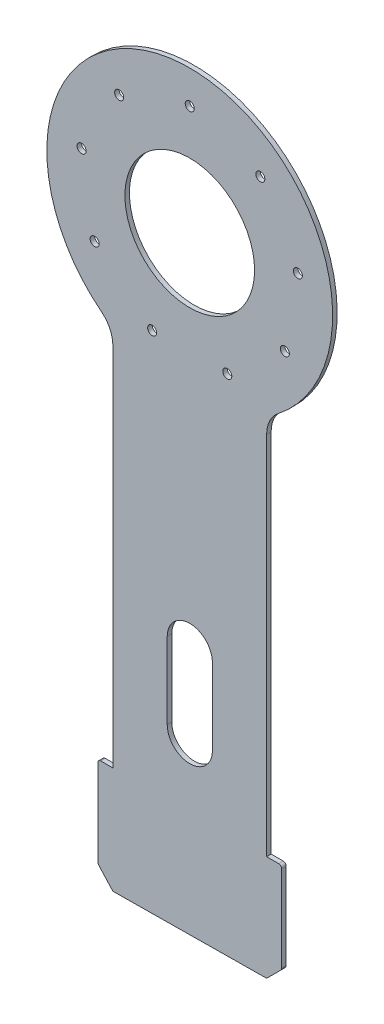
ISO-10303-21;
HEADER;
FILE_DESCRIPTION(('STEP AP214'),'2;1');
FILE_NAME('part.step','',(''),(''),'','','');
FILE_SCHEMA(('AUTOMOTIVE_DESIGN { 1 0 10303 214 1 1 1 1 }'));
ENDSEC;
DATA;
#1=APPLICATION_CONTEXT('core data for automotive mechanical design processes');
#2=APPLICATION_PROTOCOL_DEFINITION('international standard','automotive_design',2000,#1);
#3=PRODUCT_CONTEXT('',#1,'mechanical');
#4=PRODUCT('Part','Part','',(#3));
#5=PRODUCT_RELATED_PRODUCT_CATEGORY('part','',(#4));
#6=PRODUCT_DEFINITION_FORMATION('','',#4);
#7=PRODUCT_DEFINITION_CONTEXT('part definition',#1,'design');
#8=PRODUCT_DEFINITION('design','',#6,#7);
#9=PRODUCT_DEFINITION_SHAPE('','',#8);
#10=(LENGTH_UNIT() NAMED_UNIT(*) SI_UNIT(.MILLI.,.METRE.));
#11=(NAMED_UNIT(*) PLANE_ANGLE_UNIT() SI_UNIT($,.RADIAN.));
#12=(NAMED_UNIT(*) SI_UNIT($,.STERADIAN.) SOLID_ANGLE_UNIT());
#13=UNCERTAINTY_MEASURE_WITH_UNIT(LENGTH_MEASURE(1.E-05),#10,'distance_accuracy_value','');
#14=(GEOMETRIC_REPRESENTATION_CONTEXT(3) GLOBAL_UNCERTAINTY_ASSIGNED_CONTEXT((#13)) GLOBAL_UNIT_ASSIGNED_CONTEXT((#10,
#11,#12)) REPRESENTATION_CONTEXT('',''));
#15=CARTESIAN_POINT('',(0.,0.,0.));
#16=DIRECTION('',(0.,0.,1.));
#17=DIRECTION('',(1.,0.,0.));
#18=AXIS2_PLACEMENT_3D('',#15,#16,#17);
#19=CARTESIAN_POINT('',(0.,0.,1.5));
#20=DIRECTION('',(0.,0.,1.));
#21=DIRECTION('',(1.,0.,0.));
#22=AXIS2_PLACEMENT_3D('',#19,#20,#21);
#23=PLANE('',#22);
#24=CARTESIAN_POINT('',(0.0199531847322761,-145.2854308119,1.5));
#25=DIRECTION('',(0.,0.,-1.));
#26=DIRECTION('',(-1.,0.,0.));
#27=AXIS2_PLACEMENT_3D('',#24,#25,#26);
#28=CIRCLE('',#27,7.5);
#29=CARTESIAN_POINT('',(7.51995318473228,-145.2854308119,1.5));
#30=VERTEX_POINT('',#29);
#31=CARTESIAN_POINT('',(-7.48004681526772,-145.2854308119,1.5));
#32=VERTEX_POINT('',#31);
#33=EDGE_CURVE('E196',#30,#32,#28,.T.);
#34=ORIENTED_EDGE('',*,*,#33,.T.);
#35=DIRECTION('',(0.,1.,0.));
#36=VECTOR('',#35,1.);
#37=CARTESIAN_POINT('',(-7.48004681526772,-145.2854308119,1.5));
#38=LINE('',#37,#36);
#39=CARTESIAN_POINT('',(-7.48004681526772,-119.8854308119,1.5));
#40=VERTEX_POINT('',#39);
#41=EDGE_CURVE('E206',#32,#40,#38,.T.);
#42=ORIENTED_EDGE('',*,*,#41,.T.);
#43=CARTESIAN_POINT('',(0.0199531847322759,-119.8854308119,1.5));
#44=DIRECTION('',(0.,0.,-1.));
#45=DIRECTION('',(-1.,0.,0.));
#46=AXIS2_PLACEMENT_3D('',#43,#44,#45);
#47=CIRCLE('',#46,7.5);
#48=CARTESIAN_POINT('',(7.51995318473228,-119.8854308119,1.5));
#49=VERTEX_POINT('',#48);
#50=EDGE_CURVE('E61',#40,#49,#47,.T.);
#51=ORIENTED_EDGE('',*,*,#50,.T.);
#52=DIRECTION('',(0.,-1.,0.));
#53=VECTOR('',#52,1.);
#54=CARTESIAN_POINT('',(7.51995318473228,-145.2854308119,1.5));
#55=LINE('',#54,#53);
#56=EDGE_CURVE('E203',#49,#30,#55,.T.);
#57=ORIENTED_EDGE('',*,*,#56,.T.);
#58=EDGE_LOOP('',(#34,#42,#51,#57));
#59=FACE_BOUND('',#58,.T.);
#60=DIRECTION('',(0.,-1.,0.));
#61=VECTOR('',#60,1.);
#62=CARTESIAN_POINT('',(-30.5634382136855,-166.784492961634,1.5));
#63=LINE('',#62,#61);
#64=CARTESIAN_POINT('',(-30.5634382136855,-167.784492961634,1.5));
#65=VERTEX_POINT('',#64);
#66=CARTESIAN_POINT('',(-30.5634382136855,-196.39800400519,1.5));
#67=VERTEX_POINT('',#66);
#68=EDGE_CURVE('E283',#65,#67,#63,.T.);
#69=ORIENTED_EDGE('',*,*,#68,.T.);
#70=CARTESIAN_POINT('',(-29.5634382136855,-196.39800400519,1.5));
#71=DIRECTION('',(0.,0.,1.));
#72=DIRECTION('',(1.,0.,0.));
#73=AXIS2_PLACEMENT_3D('',#70,#71,#72);
#74=CIRCLE('',#73,1.);
#75=CARTESIAN_POINT('',(-30.3035162897634,-197.070524964944,1.5));
#76=VERTEX_POINT('',#75);
#77=EDGE_CURVE('E468',#67,#76,#74,.T.);
#78=ORIENTED_EDGE('',*,*,#77,.T.);
#79=DIRECTION('',(0.672520959754308,-0.740078076077885,0.));
#80=VECTOR('',#79,1.);
#81=CARTESIAN_POINT('',(-30.5634382136855,-196.784492961634,1.5));
#82=LINE('',#81,#80);
#83=CARTESIAN_POINT('',(-25.864982452456,-201.954925272885,1.5));
#84=VERTEX_POINT('',#83);
#85=EDGE_CURVE('E287',#76,#84,#82,.T.);
#86=ORIENTED_EDGE('',*,*,#85,.T.);
#87=CARTESIAN_POINT('',(-25.1249043763781,-201.282404313131,1.5));
#88=DIRECTION('',(0.,0.,1.));
#89=DIRECTION('',(1.,0.,0.));
#90=AXIS2_PLACEMENT_3D('',#87,#88,#89);
#91=CIRCLE('',#90,1.);
#92=CARTESIAN_POINT('',(-25.1150809031183,-202.282356061653,1.5));
#93=VERTEX_POINT('',#92);
#94=EDGE_CURVE('E465',#84,#93,#91,.T.);
#95=ORIENTED_EDGE('',*,*,#94,.T.);
#96=DIRECTION('',(0.999951748522454,0.00982347325978616,0.));
#97=VECTOR('',#96,1.);
#98=CARTESIAN_POINT('',(25.5634382136855,-201.784492961634,1.5));
#99=LINE('',#98,#97);
#100=CARTESIAN_POINT('',(25.1549872725829,-201.788505562146,1.5));
#101=VERTEX_POINT('',#100);
#102=EDGE_CURVE('E291',#93,#101,#99,.T.);
#103=ORIENTED_EDGE('',*,*,#102,.T.);
#104=CARTESIAN_POINT('',(25.1451637993231,-200.788553813623,1.5));
#105=DIRECTION('',(0.,0.,1.));
#106=DIRECTION('',(1.,0.,0.));
#107=AXIS2_PLACEMENT_3D('',#104,#105,#106);
#108=CIRCLE('',#107,1.);
#109=CARTESIAN_POINT('',(25.8522705805096,-201.49566059481,1.5));
#110=VERTEX_POINT('',#109);
#111=EDGE_CURVE('E462',#101,#110,#108,.T.);
#112=ORIENTED_EDGE('',*,*,#111,.T.);
#113=DIRECTION('',(0.707106781186548,0.707106781186547,0.));
#114=VECTOR('',#113,1.);
#115=CARTESIAN_POINT('',(30.5634382136856,-196.784492961634,1.5));
#116=LINE('',#115,#114);
#117=CARTESIAN_POINT('',(30.2705449948722,-197.077386180447,1.5));
#118=VERTEX_POINT('',#117);
#119=EDGE_CURVE('E295',#110,#118,#116,.T.);
#120=ORIENTED_EDGE('',*,*,#119,.T.);
#121=CARTESIAN_POINT('',(29.5634382136856,-196.370279399261,1.5));
#122=DIRECTION('',(0.,0.,1.));
#123=DIRECTION('',(1.,0.,0.));
#124=AXIS2_PLACEMENT_3D('',#121,#122,#123);
#125=CIRCLE('',#124,1.);
#126=CARTESIAN_POINT('',(30.5634382136856,-196.370279399261,1.5));
#127=VERTEX_POINT('',#126);
#128=EDGE_CURVE('E459',#118,#127,#125,.T.);
#129=ORIENTED_EDGE('',*,*,#128,.T.);
#130=DIRECTION('',(0.,1.,0.));
#131=VECTOR('',#130,1.);
#132=CARTESIAN_POINT('',(30.5634382136856,-166.774492961634,1.5));
#133=LINE('',#132,#131);
#134=CARTESIAN_POINT('',(30.5634382136856,-167.774492961634,1.5));
#135=VERTEX_POINT('',#134);
#136=EDGE_CURVE('E299',#127,#135,#133,.T.);
#137=ORIENTED_EDGE('',*,*,#136,.T.);
#138=CARTESIAN_POINT('',(29.5634382136856,-167.774492961634,1.5));
#139=DIRECTION('',(0.,0.,1.));
#140=DIRECTION('',(1.,0.,0.));
#141=AXIS2_PLACEMENT_3D('',#138,#139,#140);
#142=CIRCLE('',#141,1.);
#143=CARTESIAN_POINT('',(29.5634382136856,-166.774492961634,1.5));
#144=VERTEX_POINT('',#143);
#145=EDGE_CURVE('E435',#135,#144,#142,.T.);
#146=ORIENTED_EDGE('',*,*,#145,.T.);
#147=DIRECTION('',(-1.,0.,0.));
#148=VECTOR('',#147,1.);
#149=CARTESIAN_POINT('',(25.5634382136855,-166.774492961634,1.5));
#150=LINE('',#149,#148);
#151=CARTESIAN_POINT('',(25.5634382136855,-166.774492961634,1.5));
#152=VERTEX_POINT('',#151);
#153=EDGE_CURVE('E302',#144,#152,#150,.T.);
#154=ORIENTED_EDGE('',*,*,#153,.T.);
#155=DIRECTION('',(0.,1.,0.));
#156=VECTOR('',#155,1.);
#157=CARTESIAN_POINT('',(25.5634382136855,-40.0344929616335,1.5));
#158=LINE('',#157,#156);
#159=CARTESIAN_POINT('',(25.5634382136855,-45.1828713388312,1.5));
#160=VERTEX_POINT('',#159);
#161=EDGE_CURVE('E246',#152,#160,#158,.T.);
#162=ORIENTED_EDGE('',*,*,#161,.T.);
#163=CARTESIAN_POINT('',(35.5634382136855,-45.1828713388312,1.5));
#164=DIRECTION('',(0.,0.,1.));
#165=DIRECTION('',(1.,0.,0.));
#166=AXIS2_PLACEMENT_3D('',#163,#164,#165);
#167=CIRCLE('',#166,10.);
#168=CARTESIAN_POINT('',(29.3784924373924,-37.3249806712084,1.5));
#169=VERTEX_POINT('',#168);
#170=EDGE_CURVE('E422',#160,#169,#167,.F.);
#171=ORIENTED_EDGE('',*,*,#170,.T.);
#172=CARTESIAN_POINT('',(0.,0.,1.5));
#173=DIRECTION('',(0.,0.,1.));
#174=DIRECTION('',(1.,0.,0.));
#175=AXIS2_PLACEMENT_3D('',#172,#173,#174);
#176=CIRCLE('',#175,47.5);
#177=CARTESIAN_POINT('',(-29.3784924373924,-37.3249806712084,1.5));
#178=VERTEX_POINT('',#177);
#179=EDGE_CURVE('E396',#169,#178,#176,.T.);
#180=ORIENTED_EDGE('',*,*,#179,.T.);
#181=CARTESIAN_POINT('',(-35.5634382136855,-45.1828713388312,1.5));
#182=DIRECTION('',(0.,0.,1.));
#183=DIRECTION('',(1.,0.,0.));
#184=AXIS2_PLACEMENT_3D('',#181,#182,#183);
#185=CIRCLE('',#184,10.);
#186=CARTESIAN_POINT('',(-25.5634382136855,-45.1828713388312,1.5));
#187=VERTEX_POINT('',#186);
#188=EDGE_CURVE('E408',#178,#187,#185,.F.);
#189=ORIENTED_EDGE('',*,*,#188,.T.);
#190=DIRECTION('',(0.,-1.,0.));
#191=VECTOR('',#190,1.);
#192=CARTESIAN_POINT('',(-25.5634382136855,-40.0344929616335,1.5));
#193=LINE('',#192,#191);
#194=CARTESIAN_POINT('',(-25.5634382136855,-166.784492961634,1.5));
#195=VERTEX_POINT('',#194);
#196=EDGE_CURVE('E236',#187,#195,#193,.T.);
#197=ORIENTED_EDGE('',*,*,#196,.T.);
#198=DIRECTION('',(-1.,0.,0.));
#199=VECTOR('',#198,1.);
#200=CARTESIAN_POINT('',(-25.5634382136855,-166.784492961634,1.5));
#201=LINE('',#200,#199);
#202=CARTESIAN_POINT('',(-29.5634382136855,-166.784492961634,1.5));
#203=VERTEX_POINT('',#202);
#204=EDGE_CURVE('E279',#195,#203,#201,.T.);
#205=ORIENTED_EDGE('',*,*,#204,.T.);
#206=CARTESIAN_POINT('',(-29.5634382136855,-167.784492961634,1.5));
#207=DIRECTION('',(0.,0.,1.));
#208=DIRECTION('',(1.,0.,0.));
#209=AXIS2_PLACEMENT_3D('',#206,#207,#208);
#210=CIRCLE('',#209,1.);
#211=EDGE_CURVE('E432',#203,#65,#210,.T.);
#212=ORIENTED_EDGE('',*,*,#211,.T.);
#213=EDGE_LOOP('',(#69,#78,#86,#95,#103,#112,#120,#129,#137,#146,#154,#162,#171,#180,#189,#197,
#205,#212));
#214=FACE_BOUND('',#213,.T.);
#215=CARTESIAN_POINT('',(23.4617477535583,27.960622173843,1.5));
#216=DIRECTION('',(0.,0.,1.));
#217=DIRECTION('',(1.,0.,0.));
#218=AXIS2_PLACEMENT_3D('',#215,#216,#217);
#219=CIRCLE('',#218,1.49999999999999);
#220=CARTESIAN_POINT('',(24.9617477535583,27.960622173843,1.5));
#221=VERTEX_POINT('',#220);
#222=EDGE_CURVE('E312',#221,#221,#219,.T.);
#223=ORIENTED_EDGE('',*,*,#222,.F.);
#224=EDGE_LOOP('',(#223));
#225=FACE_BOUND('',#224,.T.);
#226=CARTESIAN_POINT('',(35.9454829849455,6.33815848484333,1.5));
#227=DIRECTION('',(0.,0.,1.));
#228=DIRECTION('',(1.,0.,0.));
#229=AXIS2_PLACEMENT_3D('',#226,#227,#228);
#230=CIRCLE('',#229,1.49999999999999);
#231=CARTESIAN_POINT('',(37.4454829849455,6.33815848484333,1.5));
#232=VERTEX_POINT('',#231);
#233=EDGE_CURVE('E323',#232,#232,#230,.T.);
#234=ORIENTED_EDGE('',*,*,#233,.F.);
#235=EDGE_LOOP('',(#234));
#236=FACE_BOUND('',#235,.T.);
#237=CARTESIAN_POINT('',(31.6099272381322,-18.2499999999997,1.5));
#238=DIRECTION('',(0.,0.,1.));
#239=DIRECTION('',(1.,0.,0.));
#240=AXIS2_PLACEMENT_3D('',#237,#238,#239);
#241=CIRCLE('',#240,1.49999999999999);
#242=CARTESIAN_POINT('',(33.1099272381322,-18.2499999999997,1.5));
#243=VERTEX_POINT('',#242);
#244=EDGE_CURVE('E331',#243,#243,#241,.T.);
#245=ORIENTED_EDGE('',*,*,#244,.F.);
#246=EDGE_LOOP('',(#245));
#247=FACE_BOUND('',#246,.T.);
#248=CARTESIAN_POINT('',(12.4837352313872,-34.2987806586856,1.5));
#249=DIRECTION('',(0.,0.,1.));
#250=DIRECTION('',(1.,0.,0.));
#251=AXIS2_PLACEMENT_3D('',#248,#249,#250);
#252=CIRCLE('',#251,1.49999999999999);
#253=CARTESIAN_POINT('',(13.9837352313872,-34.2987806586856,1.5));
#254=VERTEX_POINT('',#253);
#255=EDGE_CURVE('E339',#254,#254,#252,.T.);
#256=ORIENTED_EDGE('',*,*,#255,.F.);
#257=EDGE_LOOP('',(#256));
#258=FACE_BOUND('',#257,.T.);
#259=CARTESIAN_POINT('',(-12.4837352313867,-34.2987806586857,1.5));
#260=DIRECTION('',(0.,0.,1.));
#261=DIRECTION('',(1.,0.,0.));
#262=AXIS2_PLACEMENT_3D('',#259,#260,#261);
#263=CIRCLE('',#262,1.49999999999999);
#264=CARTESIAN_POINT('',(-10.9837352313867,-34.2987806586857,1.5));
#265=VERTEX_POINT('',#264);
#266=EDGE_CURVE('E347',#265,#265,#263,.T.);
#267=ORIENTED_EDGE('',*,*,#266,.F.);
#268=EDGE_LOOP('',(#267));
#269=FACE_BOUND('',#268,.T.);
#270=CARTESIAN_POINT('',(-31.6099272381319,-18.2500000000001,1.5));
#271=DIRECTION('',(0.,0.,1.));
#272=DIRECTION('',(1.,0.,0.));
#273=AXIS2_PLACEMENT_3D('',#270,#271,#272);
#274=CIRCLE('',#273,1.49999999999999);
#275=CARTESIAN_POINT('',(-30.1099272381319,-18.2500000000001,1.5));
#276=VERTEX_POINT('',#275);
#277=EDGE_CURVE('E355',#276,#276,#274,.T.);
#278=ORIENTED_EDGE('',*,*,#277,.F.);
#279=EDGE_LOOP('',(#278));
#280=FACE_BOUND('',#279,.T.);
#281=CARTESIAN_POINT('',(-35.9454829849456,6.33815848484285,1.5));
#282=DIRECTION('',(0.,0.,1.));
#283=DIRECTION('',(1.,0.,0.));
#284=AXIS2_PLACEMENT_3D('',#281,#282,#283);
#285=CIRCLE('',#284,1.49999999999999);
#286=CARTESIAN_POINT('',(-34.4454829849456,6.33815848484285,1.5));
#287=VERTEX_POINT('',#286);
#288=EDGE_CURVE('E363',#287,#287,#285,.T.);
#289=ORIENTED_EDGE('',*,*,#288,.F.);
#290=EDGE_LOOP('',(#289));
#291=FACE_BOUND('',#290,.T.);
#292=CARTESIAN_POINT('',(-23.4617477535587,27.9606221738427,1.5));
#293=DIRECTION('',(0.,0.,1.));
#294=DIRECTION('',(1.,0.,0.));
#295=AXIS2_PLACEMENT_3D('',#292,#293,#294);
#296=CIRCLE('',#295,1.49999999999999);
#297=CARTESIAN_POINT('',(-21.9617477535587,27.9606221738427,1.5));
#298=VERTEX_POINT('',#297);
#299=EDGE_CURVE('E371',#298,#298,#296,.T.);
#300=ORIENTED_EDGE('',*,*,#299,.F.);
#301=EDGE_LOOP('',(#300));
#302=FACE_BOUND('',#301,.T.);
#303=CARTESIAN_POINT('',(0.,36.5,1.5));
#304=DIRECTION('',(0.,0.,1.));
#305=DIRECTION('',(1.,0.,0.));
#306=AXIS2_PLACEMENT_3D('',#303,#304,#305);
#307=CIRCLE('',#306,1.49999999999999);
#308=CARTESIAN_POINT('',(1.49999999999999,36.5,1.5));
#309=VERTEX_POINT('',#308);
#310=EDGE_CURVE('E379',#309,#309,#307,.T.);
#311=ORIENTED_EDGE('',*,*,#310,.F.);
#312=EDGE_LOOP('',(#311));
#313=FACE_BOUND('',#312,.T.);
#314=CARTESIAN_POINT('',(0.,0.,1.5));
#315=DIRECTION('',(0.,0.,1.));
#316=DIRECTION('',(1.,0.,0.));
#317=AXIS2_PLACEMENT_3D('',#314,#315,#316);
#318=CIRCLE('',#317,21.55);
#319=CARTESIAN_POINT('',(21.55,0.,1.5));
#320=VERTEX_POINT('',#319);
#321=EDGE_CURVE('E388',#320,#320,#318,.T.);
#322=ORIENTED_EDGE('',*,*,#321,.F.);
#323=EDGE_LOOP('',(#322));
#324=FACE_BOUND('',#323,.T.);
#325=ADVANCED_FACE('F45',(#59,#214,#225,#236,#247,#258,#269,#280,#291,#302,#313,#324),#23,.T.);
#326=CARTESIAN_POINT('',(0.,0.,0.));
#327=DIRECTION('',(0.,0.,1.));
#328=DIRECTION('',(1.,0.,0.));
#329=AXIS2_PLACEMENT_3D('',#326,#327,#328);
#330=PLANE('',#329);
#331=DIRECTION('',(0.,1.,0.));
#332=VECTOR('',#331,1.);
#333=CARTESIAN_POINT('',(-7.48004681526772,-145.2854308119,0.));
#334=LINE('',#333,#332);
#335=CARTESIAN_POINT('',(-7.48004681526772,-145.2854308119,0.));
#336=VERTEX_POINT('',#335);
#337=CARTESIAN_POINT('',(-7.48004681526772,-119.8854308119,0.));
#338=VERTEX_POINT('',#337);
#339=EDGE_CURVE('E227',#336,#338,#334,.T.);
#340=ORIENTED_EDGE('',*,*,#339,.F.);
#341=CARTESIAN_POINT('',(0.0199531847322761,-145.2854308119,0.));
#342=DIRECTION('',(0.,0.,-1.));
#343=DIRECTION('',(-1.,0.,0.));
#344=AXIS2_PLACEMENT_3D('',#341,#342,#343);
#345=CIRCLE('',#344,7.5);
#346=CARTESIAN_POINT('',(7.51995318473228,-145.2854308119,0.));
#347=VERTEX_POINT('',#346);
#348=EDGE_CURVE('E69',#347,#336,#345,.T.);
#349=ORIENTED_EDGE('',*,*,#348,.F.);
#350=DIRECTION('',(0.,-1.,0.));
#351=VECTOR('',#350,1.);
#352=CARTESIAN_POINT('',(7.51995318473228,-145.2854308119,0.));
#353=LINE('',#352,#351);
#354=CARTESIAN_POINT('',(7.51995318473228,-119.8854308119,0.));
#355=VERTEX_POINT('',#354);
#356=EDGE_CURVE('E214',#355,#347,#353,.T.);
#357=ORIENTED_EDGE('',*,*,#356,.F.);
#358=CARTESIAN_POINT('',(0.0199531847322759,-119.8854308119,0.));
#359=DIRECTION('',(0.,0.,-1.));
#360=DIRECTION('',(-1.,0.,0.));
#361=AXIS2_PLACEMENT_3D('',#358,#359,#360);
#362=CIRCLE('',#361,7.5);
#363=EDGE_CURVE('E218',#338,#355,#362,.T.);
#364=ORIENTED_EDGE('',*,*,#363,.F.);
#365=EDGE_LOOP('',(#340,#349,#357,#364));
#366=FACE_BOUND('',#365,.T.);
#367=CARTESIAN_POINT('',(23.4617477535583,27.960622173843,0.));
#368=DIRECTION('',(0.,0.,1.));
#369=DIRECTION('',(1.,0.,0.));
#370=AXIS2_PLACEMENT_3D('',#367,#368,#369);
#371=CIRCLE('',#370,1.49999999999999);
#372=CARTESIAN_POINT('',(24.9617477535583,27.960622173843,0.));
#373=VERTEX_POINT('',#372);
#374=EDGE_CURVE('E319',#373,#373,#371,.T.);
#375=ORIENTED_EDGE('',*,*,#374,.T.);
#376=EDGE_LOOP('',(#375));
#377=FACE_BOUND('',#376,.T.);
#378=CARTESIAN_POINT('',(35.9454829849455,6.33815848484333,0.));
#379=DIRECTION('',(0.,0.,1.));
#380=DIRECTION('',(1.,0.,0.));
#381=AXIS2_PLACEMENT_3D('',#378,#379,#380);
#382=CIRCLE('',#381,1.49999999999999);
#383=CARTESIAN_POINT('',(37.4454829849455,6.33815848484333,0.));
#384=VERTEX_POINT('',#383);
#385=EDGE_CURVE('E327',#384,#384,#382,.T.);
#386=ORIENTED_EDGE('',*,*,#385,.T.);
#387=EDGE_LOOP('',(#386));
#388=FACE_BOUND('',#387,.T.);
#389=CARTESIAN_POINT('',(31.6099272381322,-18.2499999999997,0.));
#390=DIRECTION('',(0.,0.,1.));
#391=DIRECTION('',(1.,0.,0.));
#392=AXIS2_PLACEMENT_3D('',#389,#390,#391);
#393=CIRCLE('',#392,1.49999999999999);
#394=CARTESIAN_POINT('',(33.1099272381322,-18.2499999999997,0.));
#395=VERTEX_POINT('',#394);
#396=EDGE_CURVE('E335',#395,#395,#393,.T.);
#397=ORIENTED_EDGE('',*,*,#396,.T.);
#398=EDGE_LOOP('',(#397));
#399=FACE_BOUND('',#398,.T.);
#400=CARTESIAN_POINT('',(12.4837352313872,-34.2987806586856,0.));
#401=DIRECTION('',(0.,0.,1.));
#402=DIRECTION('',(1.,0.,0.));
#403=AXIS2_PLACEMENT_3D('',#400,#401,#402);
#404=CIRCLE('',#403,1.49999999999999);
#405=CARTESIAN_POINT('',(13.9837352313872,-34.2987806586856,0.));
#406=VERTEX_POINT('',#405);
#407=EDGE_CURVE('E343',#406,#406,#404,.T.);
#408=ORIENTED_EDGE('',*,*,#407,.T.);
#409=EDGE_LOOP('',(#408));
#410=FACE_BOUND('',#409,.T.);
#411=CARTESIAN_POINT('',(-12.4837352313867,-34.2987806586857,0.));
#412=DIRECTION('',(0.,0.,1.));
#413=DIRECTION('',(1.,0.,0.));
#414=AXIS2_PLACEMENT_3D('',#411,#412,#413);
#415=CIRCLE('',#414,1.49999999999999);
#416=CARTESIAN_POINT('',(-10.9837352313867,-34.2987806586857,0.));
#417=VERTEX_POINT('',#416);
#418=EDGE_CURVE('E351',#417,#417,#415,.T.);
#419=ORIENTED_EDGE('',*,*,#418,.T.);
#420=EDGE_LOOP('',(#419));
#421=FACE_BOUND('',#420,.T.);
#422=CARTESIAN_POINT('',(-31.6099272381319,-18.2500000000001,0.));
#423=DIRECTION('',(0.,0.,1.));
#424=DIRECTION('',(1.,0.,0.));
#425=AXIS2_PLACEMENT_3D('',#422,#423,#424);
#426=CIRCLE('',#425,1.49999999999999);
#427=CARTESIAN_POINT('',(-30.1099272381319,-18.2500000000001,0.));
#428=VERTEX_POINT('',#427);
#429=EDGE_CURVE('E359',#428,#428,#426,.T.);
#430=ORIENTED_EDGE('',*,*,#429,.T.);
#431=EDGE_LOOP('',(#430));
#432=FACE_BOUND('',#431,.T.);
#433=CARTESIAN_POINT('',(-35.9454829849456,6.33815848484285,0.));
#434=DIRECTION('',(0.,0.,1.));
#435=DIRECTION('',(1.,0.,0.));
#436=AXIS2_PLACEMENT_3D('',#433,#434,#435);
#437=CIRCLE('',#436,1.49999999999999);
#438=CARTESIAN_POINT('',(-34.4454829849456,6.33815848484285,0.));
#439=VERTEX_POINT('',#438);
#440=EDGE_CURVE('E367',#439,#439,#437,.T.);
#441=ORIENTED_EDGE('',*,*,#440,.T.);
#442=EDGE_LOOP('',(#441));
#443=FACE_BOUND('',#442,.T.);
#444=CARTESIAN_POINT('',(-23.4617477535587,27.9606221738427,0.));
#445=DIRECTION('',(0.,0.,1.));
#446=DIRECTION('',(1.,0.,0.));
#447=AXIS2_PLACEMENT_3D('',#444,#445,#446);
#448=CIRCLE('',#447,1.49999999999999);
#449=CARTESIAN_POINT('',(-21.9617477535587,27.9606221738427,0.));
#450=VERTEX_POINT('',#449);
#451=EDGE_CURVE('E375',#450,#450,#448,.T.);
#452=ORIENTED_EDGE('',*,*,#451,.T.);
#453=EDGE_LOOP('',(#452));
#454=FACE_BOUND('',#453,.T.);
#455=CARTESIAN_POINT('',(0.,36.5,0.));
#456=DIRECTION('',(0.,0.,1.));
#457=DIRECTION('',(1.,0.,0.));
#458=AXIS2_PLACEMENT_3D('',#455,#456,#457);
#459=CIRCLE('',#458,1.49999999999999);
#460=CARTESIAN_POINT('',(1.49999999999999,36.5,0.));
#461=VERTEX_POINT('',#460);
#462=EDGE_CURVE('E383',#461,#461,#459,.T.);
#463=ORIENTED_EDGE('',*,*,#462,.T.);
#464=EDGE_LOOP('',(#463));
#465=FACE_BOUND('',#464,.T.);
#466=DIRECTION('',(0.672520959754308,-0.740078076077885,0.));
#467=VECTOR('',#466,1.);
#468=CARTESIAN_POINT('',(-30.5634382136855,-196.784492961634,0.));
#469=LINE('',#468,#467);
#470=CARTESIAN_POINT('',(-30.3035162897634,-197.070524964944,0.));
#471=VERTEX_POINT('',#470);
#472=CARTESIAN_POINT('',(-25.864982452456,-201.954925272885,0.));
#473=VERTEX_POINT('',#472);
#474=EDGE_CURVE('E254',#471,#473,#469,.T.);
#475=ORIENTED_EDGE('',*,*,#474,.F.);
#476=CARTESIAN_POINT('',(-29.5634382136855,-196.39800400519,0.));
#477=DIRECTION('',(0.,0.,1.));
#478=DIRECTION('',(1.,0.,0.));
#479=AXIS2_PLACEMENT_3D('',#476,#477,#478);
#480=CIRCLE('',#479,1.);
#481=CARTESIAN_POINT('',(-30.5634382136855,-196.39800400519,0.));
#482=VERTEX_POINT('',#481);
#483=EDGE_CURVE('E487',#471,#482,#480,.F.);
#484=ORIENTED_EDGE('',*,*,#483,.T.);
#485=DIRECTION('',(0.,-1.,0.));
#486=VECTOR('',#485,1.);
#487=CARTESIAN_POINT('',(-30.5634382136855,-166.784492961634,0.));
#488=LINE('',#487,#486);
#489=CARTESIAN_POINT('',(-30.5634382136855,-167.784492961634,0.));
#490=VERTEX_POINT('',#489);
#491=EDGE_CURVE('E250',#490,#482,#488,.T.);
#492=ORIENTED_EDGE('',*,*,#491,.F.);
#493=CARTESIAN_POINT('',(-29.5634382136855,-167.784492961634,0.));
#494=DIRECTION('',(0.,0.,1.));
#495=DIRECTION('',(1.,0.,0.));
#496=AXIS2_PLACEMENT_3D('',#493,#494,#495);
#497=CIRCLE('',#496,1.);
#498=CARTESIAN_POINT('',(-29.5634382136855,-166.784492961634,0.));
#499=VERTEX_POINT('',#498);
#500=EDGE_CURVE('E441',#490,#499,#497,.F.);
#501=ORIENTED_EDGE('',*,*,#500,.T.);
#502=DIRECTION('',(-1.,0.,0.));
#503=VECTOR('',#502,1.);
#504=CARTESIAN_POINT('',(-25.5634382136855,-166.784492961634,0.));
#505=LINE('',#504,#503);
#506=CARTESIAN_POINT('',(-25.5634382136855,-166.784492961634,0.));
#507=VERTEX_POINT('',#506);
#508=EDGE_CURVE('E245',#507,#499,#505,.T.);
#509=ORIENTED_EDGE('',*,*,#508,.F.);
#510=DIRECTION('',(0.,-1.,0.));
#511=VECTOR('',#510,1.);
#512=CARTESIAN_POINT('',(-25.5634382136855,-40.0344929616335,0.));
#513=LINE('',#512,#511);
#514=CARTESIAN_POINT('',(-25.5634382136855,-45.1828713388312,0.));
#515=VERTEX_POINT('',#514);
#516=EDGE_CURVE('E242',#515,#507,#513,.T.);
#517=ORIENTED_EDGE('',*,*,#516,.F.);
#518=CARTESIAN_POINT('',(-35.5634382136855,-45.1828713388312,0.));
#519=DIRECTION('',(0.,0.,1.));
#520=DIRECTION('',(1.,0.,0.));
#521=AXIS2_PLACEMENT_3D('',#518,#519,#520);
#522=CIRCLE('',#521,10.);
#523=CARTESIAN_POINT('',(-29.3784924373924,-37.3249806712084,0.));
#524=VERTEX_POINT('',#523);
#525=EDGE_CURVE('E411',#515,#524,#522,.T.);
#526=ORIENTED_EDGE('',*,*,#525,.T.);
#527=CARTESIAN_POINT('',(0.,0.,0.));
#528=DIRECTION('',(0.,0.,1.));
#529=DIRECTION('',(1.,0.,0.));
#530=AXIS2_PLACEMENT_3D('',#527,#528,#529);
#531=CIRCLE('',#530,47.5);
#532=CARTESIAN_POINT('',(29.3784924373924,-37.3249806712084,0.));
#533=VERTEX_POINT('',#532);
#534=EDGE_CURVE('E392',#533,#524,#531,.T.);
#535=ORIENTED_EDGE('',*,*,#534,.F.);
#536=CARTESIAN_POINT('',(35.5634382136855,-45.1828713388312,0.));
#537=DIRECTION('',(0.,0.,1.));
#538=DIRECTION('',(1.,0.,0.));
#539=AXIS2_PLACEMENT_3D('',#536,#537,#538);
#540=CIRCLE('',#539,10.);
#541=CARTESIAN_POINT('',(25.5634382136855,-45.1828713388312,0.));
#542=VERTEX_POINT('',#541);
#543=EDGE_CURVE('E425',#533,#542,#540,.T.);
#544=ORIENTED_EDGE('',*,*,#543,.T.);
#545=DIRECTION('',(0.,1.,0.));
#546=VECTOR('',#545,1.);
#547=CARTESIAN_POINT('',(25.5634382136855,-40.0344929616335,0.));
#548=LINE('',#547,#546);
#549=CARTESIAN_POINT('',(25.5634382136855,-166.774492961634,0.));
#550=VERTEX_POINT('',#549);
#551=EDGE_CURVE('E272',#550,#542,#548,.T.);
#552=ORIENTED_EDGE('',*,*,#551,.F.);
#553=DIRECTION('',(-1.,0.,0.));
#554=VECTOR('',#553,1.);
#555=CARTESIAN_POINT('',(25.5634382136855,-166.774492961634,0.));
#556=LINE('',#555,#554);
#557=CARTESIAN_POINT('',(29.5634382136856,-166.774492961634,0.));
#558=VERTEX_POINT('',#557);
#559=EDGE_CURVE('E269',#558,#550,#556,.T.);
#560=ORIENTED_EDGE('',*,*,#559,.F.);
#561=CARTESIAN_POINT('',(29.5634382136856,-167.774492961634,0.));
#562=DIRECTION('',(0.,0.,1.));
#563=DIRECTION('',(1.,0.,0.));
#564=AXIS2_PLACEMENT_3D('',#561,#562,#563);
#565=CIRCLE('',#564,1.);
#566=CARTESIAN_POINT('',(30.5634382136856,-167.774492961634,0.));
#567=VERTEX_POINT('',#566);
#568=EDGE_CURVE('E444',#558,#567,#565,.F.);
#569=ORIENTED_EDGE('',*,*,#568,.T.);
#570=DIRECTION('',(0.,1.,0.));
#571=VECTOR('',#570,1.);
#572=CARTESIAN_POINT('',(30.5634382136856,-166.774492961634,0.));
#573=LINE('',#572,#571);
#574=CARTESIAN_POINT('',(30.5634382136856,-196.370279399261,0.));
#575=VERTEX_POINT('',#574);
#576=EDGE_CURVE('E266',#575,#567,#573,.T.);
#577=ORIENTED_EDGE('',*,*,#576,.F.);
#578=CARTESIAN_POINT('',(29.5634382136856,-196.370279399261,0.));
#579=DIRECTION('',(0.,0.,1.));
#580=DIRECTION('',(1.,0.,0.));
#581=AXIS2_PLACEMENT_3D('',#578,#579,#580);
#582=CIRCLE('',#581,1.);
#583=CARTESIAN_POINT('',(30.2705449948722,-197.077386180447,0.));
#584=VERTEX_POINT('',#583);
#585=EDGE_CURVE('E478',#575,#584,#582,.F.);
#586=ORIENTED_EDGE('',*,*,#585,.T.);
#587=DIRECTION('',(0.707106781186548,0.707106781186547,0.));
#588=VECTOR('',#587,1.);
#589=CARTESIAN_POINT('',(30.5634382136856,-196.784492961634,0.));
#590=LINE('',#589,#588);
#591=CARTESIAN_POINT('',(25.8522705805096,-201.49566059481,0.));
#592=VERTEX_POINT('',#591);
#593=EDGE_CURVE('E262',#592,#584,#590,.T.);
#594=ORIENTED_EDGE('',*,*,#593,.F.);
#595=CARTESIAN_POINT('',(25.1451637993231,-200.788553813623,0.));
#596=DIRECTION('',(0.,0.,1.));
#597=DIRECTION('',(1.,0.,0.));
#598=AXIS2_PLACEMENT_3D('',#595,#596,#597);
#599=CIRCLE('',#598,1.);
#600=CARTESIAN_POINT('',(25.1549872725829,-201.788505562146,0.));
#601=VERTEX_POINT('',#600);
#602=EDGE_CURVE('E481',#592,#601,#599,.F.);
#603=ORIENTED_EDGE('',*,*,#602,.T.);
#604=DIRECTION('',(0.999951748522454,0.00982347325978616,0.));
#605=VECTOR('',#604,1.);
#606=CARTESIAN_POINT('',(25.5634382136855,-201.784492961634,0.));
#607=LINE('',#606,#605);
#608=CARTESIAN_POINT('',(-25.1150809031183,-202.282356061653,0.));
#609=VERTEX_POINT('',#608);
#610=EDGE_CURVE('E258',#609,#601,#607,.T.);
#611=ORIENTED_EDGE('',*,*,#610,.F.);
#612=CARTESIAN_POINT('',(-25.1249043763781,-201.282404313131,0.));
#613=DIRECTION('',(0.,0.,1.));
#614=DIRECTION('',(1.,0.,0.));
#615=AXIS2_PLACEMENT_3D('',#612,#613,#614);
#616=CIRCLE('',#615,1.);
#617=EDGE_CURVE('E484',#609,#473,#616,.F.);
#618=ORIENTED_EDGE('',*,*,#617,.T.);
#619=EDGE_LOOP('',(#475,#484,#492,#501,#509,#517,#526,#535,#544,#552,#560,#569,#577,#586,#594,
#603,#611,#618));
#620=FACE_BOUND('',#619,.T.);
#621=CARTESIAN_POINT('',(0.,0.,0.));
#622=DIRECTION('',(0.,0.,1.));
#623=DIRECTION('',(1.,0.,0.));
#624=AXIS2_PLACEMENT_3D('',#621,#622,#623);
#625=CIRCLE('',#624,21.55);
#626=CARTESIAN_POINT('',(21.55,0.,0.));
#627=VERTEX_POINT('',#626);
#628=EDGE_CURVE('E387',#627,#627,#625,.T.);
#629=ORIENTED_EDGE('',*,*,#628,.T.);
#630=EDGE_LOOP('',(#629));
#631=FACE_BOUND('',#630,.T.);
#632=ADVANCED_FACE('F511',(#366,#377,#388,#399,#410,#421,#432,#443,#454,#465,#620,#631),#330,.F.);
#633=CARTESIAN_POINT('',(0.,0.,1.5));
#634=DIRECTION('',(0.,0.,-1.));
#635=DIRECTION('',(-1.,0.,0.));
#636=AXIS2_PLACEMENT_3D('',#633,#634,#635);
#637=CYLINDRICAL_SURFACE('',#636,47.5);
#638=ORIENTED_EDGE('',*,*,#179,.F.);
#639=DIRECTION('',(0.,0.,-1.));
#640=VECTOR('',#639,1.);
#641=CARTESIAN_POINT('',(29.3784924373924,-37.3249806712084,1.5));
#642=LINE('',#641,#640);
#643=EDGE_CURVE('E419',#169,#533,#642,.T.);
#644=ORIENTED_EDGE('',*,*,#643,.T.);
#645=ORIENTED_EDGE('',*,*,#534,.T.);
#646=DIRECTION('',(0.,0.,-1.));
#647=VECTOR('',#646,1.);
#648=CARTESIAN_POINT('',(-29.3784924373924,-37.3249806712084,1.5));
#649=LINE('',#648,#647);
#650=EDGE_CURVE('E399',#524,#178,#649,.F.);
#651=ORIENTED_EDGE('',*,*,#650,.T.);
#652=EDGE_LOOP('',(#638,#644,#645,#651));
#653=FACE_BOUND('',#652,.T.);
#654=ADVANCED_FACE('F560',(#653),#637,.T.);
#655=CARTESIAN_POINT('',(0.,0.,1.5));
#656=DIRECTION('',(0.,0.,-1.));
#657=DIRECTION('',(-1.,0.,0.));
#658=AXIS2_PLACEMENT_3D('',#655,#656,#657);
#659=CYLINDRICAL_SURFACE('',#658,21.55);
#660=ORIENTED_EDGE('',*,*,#321,.T.);
#661=EDGE_LOOP('',(#660));
#662=FACE_BOUND('',#661,.T.);
#663=ORIENTED_EDGE('',*,*,#628,.F.);
#664=EDGE_LOOP('',(#663));
#665=FACE_BOUND('',#664,.T.);
#666=ADVANCED_FACE('F601',(#662,#665),#659,.F.);
#667=CARTESIAN_POINT('',(0.,36.5,1.5));
#668=DIRECTION('',(0.,0.,1.));
#669=DIRECTION('',(1.,0.,0.));
#670=AXIS2_PLACEMENT_3D('',#667,#668,#669);
#671=CYLINDRICAL_SURFACE('',#670,1.49999999999999);
#672=ORIENTED_EDGE('',*,*,#462,.F.);
#673=EDGE_LOOP('',(#672));
#674=FACE_BOUND('',#673,.T.);
#675=ORIENTED_EDGE('',*,*,#310,.T.);
#676=EDGE_LOOP('',(#675));
#677=FACE_BOUND('',#676,.T.);
#678=ADVANCED_FACE('F716',(#674,#677),#671,.F.);
#679=CARTESIAN_POINT('',(-23.4617477535587,27.9606221738427,1.5));
#680=DIRECTION('',(0.,0.,1.));
#681=DIRECTION('',(1.,0.,0.));
#682=AXIS2_PLACEMENT_3D('',#679,#680,#681);
#683=CYLINDRICAL_SURFACE('',#682,1.49999999999999);
#684=ORIENTED_EDGE('',*,*,#451,.F.);
#685=EDGE_LOOP('',(#684));
#686=FACE_BOUND('',#685,.T.);
#687=ORIENTED_EDGE('',*,*,#299,.T.);
#688=EDGE_LOOP('',(#687));
#689=FACE_BOUND('',#688,.T.);
#690=ADVANCED_FACE('F713',(#686,#689),#683,.F.);
#691=CARTESIAN_POINT('',(-35.9454829849456,6.33815848484285,1.5));
#692=DIRECTION('',(0.,0.,1.));
#693=DIRECTION('',(1.,0.,0.));
#694=AXIS2_PLACEMENT_3D('',#691,#692,#693);
#695=CYLINDRICAL_SURFACE('',#694,1.49999999999999);
#696=ORIENTED_EDGE('',*,*,#440,.F.);
#697=EDGE_LOOP('',(#696));
#698=FACE_BOUND('',#697,.T.);
#699=ORIENTED_EDGE('',*,*,#288,.T.);
#700=EDGE_LOOP('',(#699));
#701=FACE_BOUND('',#700,.T.);
#702=ADVANCED_FACE('F709',(#698,#701),#695,.F.);
#703=CARTESIAN_POINT('',(-31.6099272381319,-18.2500000000001,1.5));
#704=DIRECTION('',(0.,0.,1.));
#705=DIRECTION('',(1.,0.,0.));
#706=AXIS2_PLACEMENT_3D('',#703,#704,#705);
#707=CYLINDRICAL_SURFACE('',#706,1.49999999999999);
#708=ORIENTED_EDGE('',*,*,#429,.F.);
#709=EDGE_LOOP('',(#708));
#710=FACE_BOUND('',#709,.T.);
#711=ORIENTED_EDGE('',*,*,#277,.T.);
#712=EDGE_LOOP('',(#711));
#713=FACE_BOUND('',#712,.T.);
#714=ADVANCED_FACE('F705',(#710,#713),#707,.F.);
#715=CARTESIAN_POINT('',(-12.4837352313867,-34.2987806586857,1.5));
#716=DIRECTION('',(0.,0.,1.));
#717=DIRECTION('',(1.,0.,0.));
#718=AXIS2_PLACEMENT_3D('',#715,#716,#717);
#719=CYLINDRICAL_SURFACE('',#718,1.49999999999999);
#720=ORIENTED_EDGE('',*,*,#418,.F.);
#721=EDGE_LOOP('',(#720));
#722=FACE_BOUND('',#721,.T.);
#723=ORIENTED_EDGE('',*,*,#266,.T.);
#724=EDGE_LOOP('',(#723));
#725=FACE_BOUND('',#724,.T.);
#726=ADVANCED_FACE('F701',(#722,#725),#719,.F.);
#727=CARTESIAN_POINT('',(12.4837352313872,-34.2987806586856,1.5));
#728=DIRECTION('',(0.,0.,1.));
#729=DIRECTION('',(1.,0.,0.));
#730=AXIS2_PLACEMENT_3D('',#727,#728,#729);
#731=CYLINDRICAL_SURFACE('',#730,1.49999999999999);
#732=ORIENTED_EDGE('',*,*,#407,.F.);
#733=EDGE_LOOP('',(#732));
#734=FACE_BOUND('',#733,.T.);
#735=ORIENTED_EDGE('',*,*,#255,.T.);
#736=EDGE_LOOP('',(#735));
#737=FACE_BOUND('',#736,.T.);
#738=ADVANCED_FACE('F697',(#734,#737),#731,.F.);
#739=CARTESIAN_POINT('',(31.6099272381322,-18.2499999999997,1.5));
#740=DIRECTION('',(0.,0.,1.));
#741=DIRECTION('',(1.,0.,0.));
#742=AXIS2_PLACEMENT_3D('',#739,#740,#741);
#743=CYLINDRICAL_SURFACE('',#742,1.49999999999999);
#744=ORIENTED_EDGE('',*,*,#396,.F.);
#745=EDGE_LOOP('',(#744));
#746=FACE_BOUND('',#745,.T.);
#747=ORIENTED_EDGE('',*,*,#244,.T.);
#748=EDGE_LOOP('',(#747));
#749=FACE_BOUND('',#748,.T.);
#750=ADVANCED_FACE('F693',(#746,#749),#743,.F.);
#751=CARTESIAN_POINT('',(35.9454829849455,6.33815848484333,1.5));
#752=DIRECTION('',(0.,0.,1.));
#753=DIRECTION('',(1.,0.,0.));
#754=AXIS2_PLACEMENT_3D('',#751,#752,#753);
#755=CYLINDRICAL_SURFACE('',#754,1.49999999999999);
#756=ORIENTED_EDGE('',*,*,#385,.F.);
#757=EDGE_LOOP('',(#756));
#758=FACE_BOUND('',#757,.T.);
#759=ORIENTED_EDGE('',*,*,#233,.T.);
#760=EDGE_LOOP('',(#759));
#761=FACE_BOUND('',#760,.T.);
#762=ADVANCED_FACE('F689',(#758,#761),#755,.F.);
#763=CARTESIAN_POINT('',(23.4617477535583,27.960622173843,1.5));
#764=DIRECTION('',(0.,0.,1.));
#765=DIRECTION('',(1.,0.,0.));
#766=AXIS2_PLACEMENT_3D('',#763,#764,#765);
#767=CYLINDRICAL_SURFACE('',#766,1.49999999999999);
#768=ORIENTED_EDGE('',*,*,#374,.F.);
#769=EDGE_LOOP('',(#768));
#770=FACE_BOUND('',#769,.T.);
#771=ORIENTED_EDGE('',*,*,#222,.T.);
#772=EDGE_LOOP('',(#771));
#773=FACE_BOUND('',#772,.T.);
#774=ADVANCED_FACE('F686',(#770,#773),#767,.F.);
#775=CARTESIAN_POINT('',(-25.5634382136855,-40.0344929616335,0.));
#776=DIRECTION('',(-1.,0.,0.));
#777=DIRECTION('',(0.,-1.,0.));
#778=AXIS2_PLACEMENT_3D('',#775,#776,#777);
#779=PLANE('',#778);
#780=ORIENTED_EDGE('',*,*,#196,.F.);
#781=DIRECTION('',(0.,0.,-1.));
#782=VECTOR('',#781,1.);
#783=CARTESIAN_POINT('',(-25.5634382136855,-45.1828713388312,0.));
#784=LINE('',#783,#782);
#785=EDGE_CURVE('E405',#187,#515,#784,.T.);
#786=ORIENTED_EDGE('',*,*,#785,.T.);
#787=ORIENTED_EDGE('',*,*,#516,.T.);
#788=DIRECTION('',(0.,0.,1.));
#789=VECTOR('',#788,1.);
#790=CARTESIAN_POINT('',(-25.5634382136855,-166.784492961634,0.));
#791=LINE('',#790,#789);
#792=EDGE_CURVE('E276',#507,#195,#791,.T.);
#793=ORIENTED_EDGE('',*,*,#792,.T.);
#794=EDGE_LOOP('',(#780,#786,#787,#793));
#795=FACE_BOUND('',#794,.T.);
#796=ADVANCED_FACE('F670',(#795),#779,.T.);
#797=CARTESIAN_POINT('',(25.5634382136855,-40.0344929616335,0.));
#798=DIRECTION('',(1.,0.,0.));
#799=DIRECTION('',(0.,1.,0.));
#800=AXIS2_PLACEMENT_3D('',#797,#798,#799);
#801=PLANE('',#800);
#802=ORIENTED_EDGE('',*,*,#551,.T.);
#803=DIRECTION('',(0.,0.,-1.));
#804=VECTOR('',#803,1.);
#805=CARTESIAN_POINT('',(25.5634382136855,-45.1828713388312,0.));
#806=LINE('',#805,#804);
#807=EDGE_CURVE('E415',#542,#160,#806,.F.);
#808=ORIENTED_EDGE('',*,*,#807,.T.);
#809=ORIENTED_EDGE('',*,*,#161,.F.);
#810=DIRECTION('',(0.,0.,1.));
#811=VECTOR('',#810,1.);
#812=CARTESIAN_POINT('',(25.5634382136855,-166.774492961634,0.));
#813=LINE('',#812,#811);
#814=EDGE_CURVE('E308',#550,#152,#813,.T.);
#815=ORIENTED_EDGE('',*,*,#814,.F.);
#816=EDGE_LOOP('',(#802,#808,#809,#815));
#817=FACE_BOUND('',#816,.T.);
#818=ADVANCED_FACE('F569',(#817),#801,.T.);
#819=CARTESIAN_POINT('',(25.5634382136855,-166.774492961634,0.));
#820=DIRECTION('',(0.,1.,0.));
#821=DIRECTION('',(0.,0.,1.));
#822=AXIS2_PLACEMENT_3D('',#819,#820,#821);
#823=PLANE('',#822);
#824=ORIENTED_EDGE('',*,*,#153,.F.);
#825=DIRECTION('',(0.,0.,1.));
#826=VECTOR('',#825,1.);
#827=CARTESIAN_POINT('',(29.5634382136856,-166.774492961634,0.));
#828=LINE('',#827,#826);
#829=EDGE_CURVE('E438',#144,#558,#828,.F.);
#830=ORIENTED_EDGE('',*,*,#829,.T.);
#831=ORIENTED_EDGE('',*,*,#559,.T.);
#832=ORIENTED_EDGE('',*,*,#814,.T.);
#833=EDGE_LOOP('',(#824,#830,#831,#832));
#834=FACE_BOUND('',#833,.T.);
#835=ADVANCED_FACE('F575',(#834),#823,.T.);
#836=CARTESIAN_POINT('',(30.5634382136856,-166.774492961634,0.));
#837=DIRECTION('',(1.,0.,0.));
#838=DIRECTION('',(0.,1.,0.));
#839=AXIS2_PLACEMENT_3D('',#836,#837,#838);
#840=PLANE('',#839);
#841=ORIENTED_EDGE('',*,*,#136,.F.);
#842=DIRECTION('',(0.,0.,1.));
#843=VECTOR('',#842,1.);
#844=CARTESIAN_POINT('',(30.5634382136856,-196.370279399261,0.));
#845=LINE('',#844,#843);
#846=EDGE_CURVE('E11',#127,#575,#845,.F.);
#847=ORIENTED_EDGE('',*,*,#846,.T.);
#848=ORIENTED_EDGE('',*,*,#576,.T.);
#849=DIRECTION('',(0.,0.,1.));
#850=VECTOR('',#849,1.);
#851=CARTESIAN_POINT('',(30.5634382136856,-167.774492961634,0.));
#852=LINE('',#851,#850);
#853=EDGE_CURVE('E428',#567,#135,#852,.T.);
#854=ORIENTED_EDGE('',*,*,#853,.T.);
#855=EDGE_LOOP('',(#841,#847,#848,#854));
#856=FACE_BOUND('',#855,.T.);
#857=ADVANCED_FACE('F583',(#856),#840,.T.);
#858=CARTESIAN_POINT('',(30.5634382136856,-196.784492961634,0.));
#859=DIRECTION('',(0.707106781186547,-0.707106781186548,0.));
#860=DIRECTION('',(0.707106781186548,0.707106781186547,0.));
#861=AXIS2_PLACEMENT_3D('',#858,#859,#860);
#862=PLANE('',#861);
#863=ORIENTED_EDGE('',*,*,#119,.F.);
#864=DIRECTION('',(0.,0.,1.));
#865=VECTOR('',#864,1.);
#866=CARTESIAN_POINT('',(25.8522705805096,-201.49566059481,0.));
#867=LINE('',#866,#865);
#868=EDGE_CURVE('E54',#110,#592,#867,.F.);
#869=ORIENTED_EDGE('',*,*,#868,.T.);
#870=ORIENTED_EDGE('',*,*,#593,.T.);
#871=DIRECTION('',(0.,0.,1.));
#872=VECTOR('',#871,1.);
#873=CARTESIAN_POINT('',(30.2705449948722,-197.077386180447,0.));
#874=LINE('',#873,#872);
#875=EDGE_CURVE('E497',#584,#118,#874,.T.);
#876=ORIENTED_EDGE('',*,*,#875,.T.);
#877=EDGE_LOOP('',(#863,#869,#870,#876));
#878=FACE_BOUND('',#877,.T.);
#879=ADVANCED_FACE('F505',(#878),#862,.T.);
#880=CARTESIAN_POINT('',(25.5634382136855,-201.784492961634,0.));
#881=DIRECTION('',(0.00982347325978616,-0.999951748522455,0.));
#882=DIRECTION('',(0.999951748522455,0.00982347325978616,0.));
#883=AXIS2_PLACEMENT_3D('',#880,#881,#882);
#884=PLANE('',#883);
#885=ORIENTED_EDGE('',*,*,#102,.F.);
#886=DIRECTION('',(0.,0.,1.));
#887=VECTOR('',#886,1.);
#888=CARTESIAN_POINT('',(-25.1150809031183,-202.282356061653,0.));
#889=LINE('',#888,#887);
#890=EDGE_CURVE('E494',#93,#609,#889,.F.);
#891=ORIENTED_EDGE('',*,*,#890,.T.);
#892=ORIENTED_EDGE('',*,*,#610,.T.);
#893=DIRECTION('',(0.,0.,1.));
#894=VECTOR('',#893,1.);
#895=CARTESIAN_POINT('',(25.1549872725829,-201.788505562146,0.));
#896=LINE('',#895,#894);
#897=EDGE_CURVE('E490',#601,#101,#896,.T.);
#898=ORIENTED_EDGE('',*,*,#897,.T.);
#899=EDGE_LOOP('',(#885,#891,#892,#898));
#900=FACE_BOUND('',#899,.T.);
#901=ADVANCED_FACE('F520',(#900),#884,.T.);
#902=CARTESIAN_POINT('',(-30.5634382136855,-196.784492961634,0.));
#903=DIRECTION('',(-0.740078076077885,-0.672520959754308,0.));
#904=DIRECTION('',(0.672520959754308,-0.740078076077885,0.));
#905=AXIS2_PLACEMENT_3D('',#902,#903,#904);
#906=PLANE('',#905);
#907=ORIENTED_EDGE('',*,*,#85,.F.);
#908=DIRECTION('',(0.,0.,1.));
#909=VECTOR('',#908,1.);
#910=CARTESIAN_POINT('',(-30.3035162897634,-197.070524964944,0.));
#911=LINE('',#910,#909);
#912=EDGE_CURVE('E475',#76,#471,#911,.F.);
#913=ORIENTED_EDGE('',*,*,#912,.T.);
#914=ORIENTED_EDGE('',*,*,#474,.T.);
#915=DIRECTION('',(0.,0.,1.));
#916=VECTOR('',#915,1.);
#917=CARTESIAN_POINT('',(-25.864982452456,-201.954925272885,0.));
#918=LINE('',#917,#916);
#919=EDGE_CURVE('E471',#473,#84,#918,.T.);
#920=ORIENTED_EDGE('',*,*,#919,.T.);
#921=EDGE_LOOP('',(#907,#913,#914,#920));
#922=FACE_BOUND('',#921,.T.);
#923=ADVANCED_FACE('F529',(#922),#906,.T.);
#924=CARTESIAN_POINT('',(-30.5634382136855,-166.784492961634,0.));
#925=DIRECTION('',(-1.,0.,0.));
#926=DIRECTION('',(0.,-1.,0.));
#927=AXIS2_PLACEMENT_3D('',#924,#925,#926);
#928=PLANE('',#927);
#929=ORIENTED_EDGE('',*,*,#491,.T.);
#930=DIRECTION('',(0.,0.,1.));
#931=VECTOR('',#930,1.);
#932=CARTESIAN_POINT('',(-30.5634382136855,-196.39800400519,0.));
#933=LINE('',#932,#931);
#934=EDGE_CURVE('E455',#482,#67,#933,.T.);
#935=ORIENTED_EDGE('',*,*,#934,.T.);
#936=ORIENTED_EDGE('',*,*,#68,.F.);
#937=DIRECTION('',(0.,0.,1.));
#938=VECTOR('',#937,1.);
#939=CARTESIAN_POINT('',(-30.5634382136855,-167.784492961634,0.));
#940=LINE('',#939,#938);
#941=EDGE_CURVE('E452',#65,#490,#940,.F.);
#942=ORIENTED_EDGE('',*,*,#941,.T.);
#943=EDGE_LOOP('',(#929,#935,#936,#942));
#944=FACE_BOUND('',#943,.T.);
#945=ADVANCED_FACE('F538',(#944),#928,.T.);
#946=CARTESIAN_POINT('',(-25.5634382136855,-166.784492961634,0.));
#947=DIRECTION('',(0.,1.,0.));
#948=DIRECTION('',(0.,0.,1.));
#949=AXIS2_PLACEMENT_3D('',#946,#947,#948);
#950=PLANE('',#949);
#951=ORIENTED_EDGE('',*,*,#508,.T.);
#952=DIRECTION('',(0.,0.,1.));
#953=VECTOR('',#952,1.);
#954=CARTESIAN_POINT('',(-29.5634382136855,-166.784492961634,0.));
#955=LINE('',#954,#953);
#956=EDGE_CURVE('E448',#499,#203,#955,.T.);
#957=ORIENTED_EDGE('',*,*,#956,.T.);
#958=ORIENTED_EDGE('',*,*,#204,.F.);
#959=ORIENTED_EDGE('',*,*,#792,.F.);
#960=EDGE_LOOP('',(#951,#957,#958,#959));
#961=FACE_BOUND('',#960,.T.);
#962=ADVANCED_FACE('F546',(#961),#950,.T.);
#963=CARTESIAN_POINT('',(-35.5634382136855,-45.1828713388312,1.5));
#964=DIRECTION('',(0.,0.,-1.));
#965=DIRECTION('',(-1.,0.,0.));
#966=AXIS2_PLACEMENT_3D('',#963,#964,#965);
#967=CYLINDRICAL_SURFACE('',#966,10.);
#968=ORIENTED_EDGE('',*,*,#525,.F.);
#969=ORIENTED_EDGE('',*,*,#785,.F.);
#970=ORIENTED_EDGE('',*,*,#188,.F.);
#971=ORIENTED_EDGE('',*,*,#650,.F.);
#972=EDGE_LOOP('',(#968,#969,#970,#971));
#973=FACE_BOUND('',#972,.T.);
#974=ADVANCED_FACE('F556',(#973),#967,.F.);
#975=CARTESIAN_POINT('',(35.5634382136855,-45.1828713388312,1.5));
#976=DIRECTION('',(0.,0.,-1.));
#977=DIRECTION('',(-1.,0.,0.));
#978=AXIS2_PLACEMENT_3D('',#975,#976,#977);
#979=CYLINDRICAL_SURFACE('',#978,10.);
#980=ORIENTED_EDGE('',*,*,#543,.F.);
#981=ORIENTED_EDGE('',*,*,#643,.F.);
#982=ORIENTED_EDGE('',*,*,#170,.F.);
#983=ORIENTED_EDGE('',*,*,#807,.F.);
#984=EDGE_LOOP('',(#980,#981,#982,#983));
#985=FACE_BOUND('',#984,.T.);
#986=ADVANCED_FACE('F566',(#985),#979,.F.);
#987=CARTESIAN_POINT('',(29.5634382136856,-167.774492961634,0.));
#988=DIRECTION('',(0.,0.,1.));
#989=DIRECTION('',(1.,0.,0.));
#990=AXIS2_PLACEMENT_3D('',#987,#988,#989);
#991=CYLINDRICAL_SURFACE('',#990,1.);
#992=ORIENTED_EDGE('',*,*,#568,.F.);
#993=ORIENTED_EDGE('',*,*,#829,.F.);
#994=ORIENTED_EDGE('',*,*,#145,.F.);
#995=ORIENTED_EDGE('',*,*,#853,.F.);
#996=EDGE_LOOP('',(#992,#993,#994,#995));
#997=FACE_BOUND('',#996,.T.);
#998=ADVANCED_FACE('F580',(#997),#991,.T.);
#999=CARTESIAN_POINT('',(-29.5634382136855,-167.784492961634,0.));
#1000=DIRECTION('',(0.,0.,1.));
#1001=DIRECTION('',(1.,0.,0.));
#1002=AXIS2_PLACEMENT_3D('',#999,#1000,#1001);
#1003=CYLINDRICAL_SURFACE('',#1002,1.);
#1004=ORIENTED_EDGE('',*,*,#500,.F.);
#1005=ORIENTED_EDGE('',*,*,#941,.F.);
#1006=ORIENTED_EDGE('',*,*,#211,.F.);
#1007=ORIENTED_EDGE('',*,*,#956,.F.);
#1008=EDGE_LOOP('',(#1004,#1005,#1006,#1007));
#1009=FACE_BOUND('',#1008,.T.);
#1010=ADVANCED_FACE('F544',(#1009),#1003,.T.);
#1011=CARTESIAN_POINT('',(-29.5634382136855,-196.39800400519,0.));
#1012=DIRECTION('',(0.,0.,1.));
#1013=DIRECTION('',(1.,0.,0.));
#1014=AXIS2_PLACEMENT_3D('',#1011,#1012,#1013);
#1015=CYLINDRICAL_SURFACE('',#1014,1.);
#1016=ORIENTED_EDGE('',*,*,#483,.F.);
#1017=ORIENTED_EDGE('',*,*,#912,.F.);
#1018=ORIENTED_EDGE('',*,*,#77,.F.);
#1019=ORIENTED_EDGE('',*,*,#934,.F.);
#1020=EDGE_LOOP('',(#1016,#1017,#1018,#1019));
#1021=FACE_BOUND('',#1020,.T.);
#1022=ADVANCED_FACE('F535',(#1021),#1015,.T.);
#1023=CARTESIAN_POINT('',(-25.1249043763781,-201.282404313131,0.));
#1024=DIRECTION('',(0.,0.,1.));
#1025=DIRECTION('',(1.,0.,0.));
#1026=AXIS2_PLACEMENT_3D('',#1023,#1024,#1025);
#1027=CYLINDRICAL_SURFACE('',#1026,1.);
#1028=ORIENTED_EDGE('',*,*,#617,.F.);
#1029=ORIENTED_EDGE('',*,*,#890,.F.);
#1030=ORIENTED_EDGE('',*,*,#94,.F.);
#1031=ORIENTED_EDGE('',*,*,#919,.F.);
#1032=EDGE_LOOP('',(#1028,#1029,#1030,#1031));
#1033=FACE_BOUND('',#1032,.T.);
#1034=ADVANCED_FACE('F527',(#1033),#1027,.T.);
#1035=CARTESIAN_POINT('',(25.1451637993231,-200.788553813623,0.));
#1036=DIRECTION('',(0.,0.,1.));
#1037=DIRECTION('',(1.,0.,0.));
#1038=AXIS2_PLACEMENT_3D('',#1035,#1036,#1037);
#1039=CYLINDRICAL_SURFACE('',#1038,1.);
#1040=ORIENTED_EDGE('',*,*,#602,.F.);
#1041=ORIENTED_EDGE('',*,*,#868,.F.);
#1042=ORIENTED_EDGE('',*,*,#111,.F.);
#1043=ORIENTED_EDGE('',*,*,#897,.F.);
#1044=EDGE_LOOP('',(#1040,#1041,#1042,#1043));
#1045=FACE_BOUND('',#1044,.T.);
#1046=ADVANCED_FACE('F517',(#1045),#1039,.T.);
#1047=CARTESIAN_POINT('',(29.5634382136856,-196.370279399261,0.));
#1048=DIRECTION('',(0.,0.,1.));
#1049=DIRECTION('',(1.,0.,0.));
#1050=AXIS2_PLACEMENT_3D('',#1047,#1048,#1049);
#1051=CYLINDRICAL_SURFACE('',#1050,1.);
#1052=ORIENTED_EDGE('',*,*,#585,.F.);
#1053=ORIENTED_EDGE('',*,*,#846,.F.);
#1054=ORIENTED_EDGE('',*,*,#128,.F.);
#1055=ORIENTED_EDGE('',*,*,#875,.F.);
#1056=EDGE_LOOP('',(#1052,#1053,#1054,#1055));
#1057=FACE_BOUND('',#1056,.T.);
#1058=ADVANCED_FACE('F47',(#1057),#1051,.T.);
#1059=CARTESIAN_POINT('',(0.0199531847322761,-145.2854308119,1.5));
#1060=DIRECTION('',(0.,0.,-1.));
#1061=DIRECTION('',(-1.,0.,0.));
#1062=AXIS2_PLACEMENT_3D('',#1059,#1060,#1061);
#1063=CYLINDRICAL_SURFACE('',#1062,7.5);
#1064=ORIENTED_EDGE('',*,*,#348,.T.);
#1065=DIRECTION('',(0.,0.,-1.));
#1066=VECTOR('',#1065,1.);
#1067=CARTESIAN_POINT('',(-7.48004681526772,-145.2854308119,1.5));
#1068=LINE('',#1067,#1066);
#1069=EDGE_CURVE('E192',#32,#336,#1068,.T.);
#1070=ORIENTED_EDGE('',*,*,#1069,.F.);
#1071=ORIENTED_EDGE('',*,*,#33,.F.);
#1072=DIRECTION('',(0.,0.,-1.));
#1073=VECTOR('',#1072,1.);
#1074=CARTESIAN_POINT('',(7.51995318473228,-145.2854308119,1.5));
#1075=LINE('',#1074,#1073);
#1076=EDGE_CURVE('E233',#30,#347,#1075,.T.);
#1077=ORIENTED_EDGE('',*,*,#1076,.T.);
#1078=EDGE_LOOP('',(#1064,#1070,#1071,#1077));
#1079=FACE_BOUND('',#1078,.T.);
#1080=ADVANCED_FACE('F194',(#1079),#1063,.F.);
#1081=CARTESIAN_POINT('',(7.51995318473228,-145.2854308119,1.5));
#1082=DIRECTION('',(1.,0.,0.));
#1083=DIRECTION('',(0.,0.,-1.));
#1084=AXIS2_PLACEMENT_3D('',#1081,#1082,#1083);
#1085=PLANE('',#1084);
#1086=ORIENTED_EDGE('',*,*,#356,.T.);
#1087=ORIENTED_EDGE('',*,*,#1076,.F.);
#1088=ORIENTED_EDGE('',*,*,#56,.F.);
#1089=DIRECTION('',(0.,0.,-1.));
#1090=VECTOR('',#1089,1.);
#1091=CARTESIAN_POINT('',(7.51995318473228,-119.8854308119,1.5));
#1092=LINE('',#1091,#1090);
#1093=EDGE_CURVE('E237',#49,#355,#1092,.T.);
#1094=ORIENTED_EDGE('',*,*,#1093,.T.);
#1095=EDGE_LOOP('',(#1086,#1087,#1088,#1094));
#1096=FACE_BOUND('',#1095,.T.);
#1097=ADVANCED_FACE('F592',(#1096),#1085,.F.);
#1098=CARTESIAN_POINT('',(0.0199531847322759,-119.8854308119,1.5));
#1099=DIRECTION('',(0.,0.,-1.));
#1100=DIRECTION('',(-1.,0.,0.));
#1101=AXIS2_PLACEMENT_3D('',#1098,#1099,#1100);
#1102=CYLINDRICAL_SURFACE('',#1101,7.5);
#1103=ORIENTED_EDGE('',*,*,#363,.T.);
#1104=ORIENTED_EDGE('',*,*,#1093,.F.);
#1105=ORIENTED_EDGE('',*,*,#50,.F.);
#1106=DIRECTION('',(0.,0.,-1.));
#1107=VECTOR('',#1106,1.);
#1108=CARTESIAN_POINT('',(-7.48004681526772,-119.8854308119,1.5));
#1109=LINE('',#1108,#1107);
#1110=EDGE_CURVE('E202',#40,#338,#1109,.T.);
#1111=ORIENTED_EDGE('',*,*,#1110,.T.);
#1112=EDGE_LOOP('',(#1103,#1104,#1105,#1111));
#1113=FACE_BOUND('',#1112,.T.);
#1114=ADVANCED_FACE('F647',(#1113),#1102,.F.);
#1115=CARTESIAN_POINT('',(-7.48004681526772,-145.2854308119,1.5));
#1116=DIRECTION('',(-1.,0.,0.));
#1117=DIRECTION('',(0.,0.,1.));
#1118=AXIS2_PLACEMENT_3D('',#1115,#1116,#1117);
#1119=PLANE('',#1118);
#1120=ORIENTED_EDGE('',*,*,#339,.T.);
#1121=ORIENTED_EDGE('',*,*,#1110,.F.);
#1122=ORIENTED_EDGE('',*,*,#41,.F.);
#1123=ORIENTED_EDGE('',*,*,#1069,.T.);
#1124=EDGE_LOOP('',(#1120,#1121,#1122,#1123));
#1125=FACE_BOUND('',#1124,.T.);
#1126=ADVANCED_FACE('F207',(#1125),#1119,.F.);
#1127=CLOSED_SHELL('',(#325,#632,#654,#666,#678,#690,#702,#714,#726,#738,#750,#762,#774,#796,
#818,#835,#857,#879,#901,#923,#945,#962,#974,#986,#998,#1010,#1022,#1034,#1046,#1058,#1080,
#1097,#1114,#1126));
#1128=MANIFOLD_SOLID_BREP('B2',#1127);
#1129=ADVANCED_BREP_SHAPE_REPRESENTATION('',(#18,#1128),#14);
#1130=SHAPE_DEFINITION_REPRESENTATION(#9,#1129);
ENDSEC;
END-ISO-10303-21;
